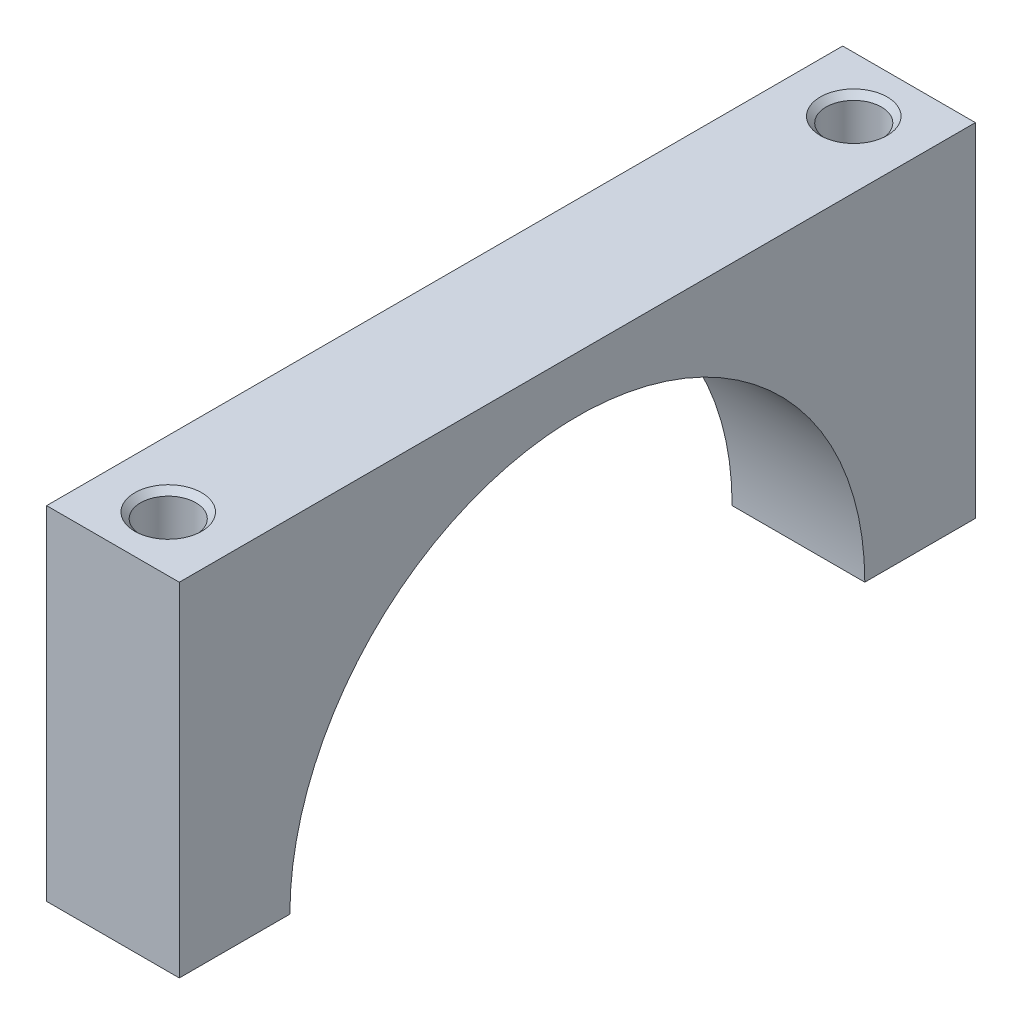
ISO-10303-21;
HEADER;
FILE_DESCRIPTION(('STEP AP214'),'2;1');
FILE_NAME('part.step','',(''),(''),'','','');
FILE_SCHEMA(('AUTOMOTIVE_DESIGN { 1 0 10303 214 1 1 1 1 }'));
ENDSEC;
DATA;
#1=APPLICATION_CONTEXT('core data for automotive mechanical design processes');
#2=APPLICATION_PROTOCOL_DEFINITION('international standard','automotive_design',2000,#1);
#3=PRODUCT_CONTEXT('',#1,'mechanical');
#4=PRODUCT('Part','Part','',(#3));
#5=PRODUCT_RELATED_PRODUCT_CATEGORY('part','',(#4));
#6=PRODUCT_DEFINITION_FORMATION('','',#4);
#7=PRODUCT_DEFINITION_CONTEXT('part definition',#1,'design');
#8=PRODUCT_DEFINITION('design','',#6,#7);
#9=PRODUCT_DEFINITION_SHAPE('','',#8);
#10=(LENGTH_UNIT() NAMED_UNIT(*) SI_UNIT(.MILLI.,.METRE.));
#11=(NAMED_UNIT(*) PLANE_ANGLE_UNIT() SI_UNIT($,.RADIAN.));
#12=(NAMED_UNIT(*) SI_UNIT($,.STERADIAN.) SOLID_ANGLE_UNIT());
#13=UNCERTAINTY_MEASURE_WITH_UNIT(LENGTH_MEASURE(1.E-05),#10,'distance_accuracy_value','');
#14=(GEOMETRIC_REPRESENTATION_CONTEXT(3) GLOBAL_UNCERTAINTY_ASSIGNED_CONTEXT((#13)) GLOBAL_UNIT_ASSIGNED_CONTEXT((#10,
#11,#12)) REPRESENTATION_CONTEXT('',''));
#15=CARTESIAN_POINT('',(0.,0.,0.));
#16=DIRECTION('',(0.,0.,1.));
#17=DIRECTION('',(1.,0.,0.));
#18=AXIS2_PLACEMENT_3D('',#15,#16,#17);
#19=CARTESIAN_POINT('',(6.,0.,36.));
#20=DIRECTION('',(0.,0.,-1.));
#21=DIRECTION('',(0.,1.,0.));
#22=AXIS2_PLACEMENT_3D('',#19,#20,#21);
#23=PLANE('',#22);
#24=DIRECTION('',(0.,-1.,0.));
#25=VECTOR('',#24,1.);
#26=CARTESIAN_POINT('',(-6.,0.,36.));
#27=LINE('',#26,#25);
#28=CARTESIAN_POINT('',(-6.,0.,36.));
#29=VERTEX_POINT('',#28);
#30=CARTESIAN_POINT('',(-6.,-31.,36.));
#31=VERTEX_POINT('',#30);
#32=EDGE_CURVE('E118',#29,#31,#27,.T.);
#33=ORIENTED_EDGE('',*,*,#32,.T.);
#34=DIRECTION('',(-1.,0.,0.));
#35=VECTOR('',#34,1.);
#36=CARTESIAN_POINT('',(6.,-31.,36.));
#37=LINE('',#36,#35);
#38=CARTESIAN_POINT('',(6.,-31.,36.));
#39=VERTEX_POINT('',#38);
#40=EDGE_CURVE('E11',#39,#31,#37,.T.);
#41=ORIENTED_EDGE('',*,*,#40,.F.);
#42=DIRECTION('',(0.,-1.,0.));
#43=VECTOR('',#42,1.);
#44=CARTESIAN_POINT('',(6.,0.,36.));
#45=LINE('',#44,#43);
#46=CARTESIAN_POINT('',(6.,0.,36.));
#47=VERTEX_POINT('',#46);
#48=EDGE_CURVE('E129',#47,#39,#45,.T.);
#49=ORIENTED_EDGE('',*,*,#48,.F.);
#50=DIRECTION('',(-1.,0.,0.));
#51=VECTOR('',#50,1.);
#52=CARTESIAN_POINT('',(6.,0.,36.));
#53=LINE('',#52,#51);
#54=EDGE_CURVE('E114',#47,#29,#53,.T.);
#55=ORIENTED_EDGE('',*,*,#54,.T.);
#56=EDGE_LOOP('',(#33,#41,#49,#55));
#57=FACE_BOUND('',#56,.T.);
#58=ADVANCED_FACE('F34',(#57),#23,.F.);
#59=CARTESIAN_POINT('',(6.,-31.,36.));
#60=DIRECTION('',(0.,1.,0.));
#61=DIRECTION('',(0.,0.,1.));
#62=AXIS2_PLACEMENT_3D('',#59,#60,#61);
#63=PLANE('',#62);
#64=CARTESIAN_POINT('',(0.,-31.,31.));
#65=DIRECTION('',(0.,1.,0.));
#66=DIRECTION('',(0.,0.,1.));
#67=AXIS2_PLACEMENT_3D('',#64,#65,#66);
#68=CIRCLE('',#67,2.49999999999999);
#69=CARTESIAN_POINT('',(0.,-31.,33.5));
#70=VERTEX_POINT('',#69);
#71=EDGE_CURVE('E184',#70,#70,#68,.T.);
#72=ORIENTED_EDGE('',*,*,#71,.T.);
#73=EDGE_LOOP('',(#72));
#74=FACE_BOUND('',#73,.T.);
#75=DIRECTION('',(0.,0.,-1.));
#76=VECTOR('',#75,1.);
#77=CARTESIAN_POINT('',(-6.,-31.,36.));
#78=LINE('',#77,#76);
#79=CARTESIAN_POINT('',(-6.,-31.,26.));
#80=VERTEX_POINT('',#79);
#81=EDGE_CURVE('E121',#31,#80,#78,.T.);
#82=ORIENTED_EDGE('',*,*,#81,.T.);
#83=DIRECTION('',(-1.,0.,0.));
#84=VECTOR('',#83,1.);
#85=CARTESIAN_POINT('',(6.,-31.,26.));
#86=LINE('',#85,#84);
#87=CARTESIAN_POINT('',(6.,-31.,26.));
#88=VERTEX_POINT('',#87);
#89=EDGE_CURVE('E42',#88,#80,#86,.T.);
#90=ORIENTED_EDGE('',*,*,#89,.F.);
#91=DIRECTION('',(0.,0.,-1.));
#92=VECTOR('',#91,1.);
#93=CARTESIAN_POINT('',(6.,-31.,36.));
#94=LINE('',#93,#92);
#95=EDGE_CURVE('E87',#39,#88,#94,.T.);
#96=ORIENTED_EDGE('',*,*,#95,.F.);
#97=ORIENTED_EDGE('',*,*,#40,.T.);
#98=EDGE_LOOP('',(#82,#90,#96,#97));
#99=FACE_BOUND('',#98,.T.);
#100=ADVANCED_FACE('F156',(#74,#99),#63,.F.);
#101=CARTESIAN_POINT('',(6.,-31.,0.));
#102=DIRECTION('',(-1.,0.,0.));
#103=DIRECTION('',(0.,0.,1.));
#104=AXIS2_PLACEMENT_3D('',#101,#102,#103);
#105=CYLINDRICAL_SURFACE('',#104,26.);
#106=CARTESIAN_POINT('',(-6.,-31.,0.));
#107=DIRECTION('',(-1.,0.,0.));
#108=DIRECTION('',(0.,0.,-1.));
#109=AXIS2_PLACEMENT_3D('',#106,#107,#108);
#110=CIRCLE('',#109,26.);
#111=CARTESIAN_POINT('',(-6.,-31.,-26.));
#112=VERTEX_POINT('',#111);
#113=EDGE_CURVE('E124',#80,#112,#110,.T.);
#114=ORIENTED_EDGE('',*,*,#113,.T.);
#115=DIRECTION('',(-1.,0.,0.));
#116=VECTOR('',#115,1.);
#117=CARTESIAN_POINT('',(6.,-31.,-26.));
#118=LINE('',#117,#116);
#119=CARTESIAN_POINT('',(6.,-31.,-26.));
#120=VERTEX_POINT('',#119);
#121=EDGE_CURVE('E109',#120,#112,#118,.T.);
#122=ORIENTED_EDGE('',*,*,#121,.F.);
#123=CARTESIAN_POINT('',(6.,-31.,0.));
#124=DIRECTION('',(-1.,0.,0.));
#125=DIRECTION('',(0.,0.,-1.));
#126=AXIS2_PLACEMENT_3D('',#123,#124,#125);
#127=CIRCLE('',#126,26.);
#128=EDGE_CURVE('E100',#88,#120,#127,.T.);
#129=ORIENTED_EDGE('',*,*,#128,.F.);
#130=ORIENTED_EDGE('',*,*,#89,.T.);
#131=EDGE_LOOP('',(#114,#122,#129,#130));
#132=FACE_BOUND('',#131,.T.);
#133=ADVANCED_FACE('F135',(#132),#105,.F.);
#134=CARTESIAN_POINT('',(6.,-31.,-36.));
#135=DIRECTION('',(0.,1.,0.));
#136=DIRECTION('',(0.,0.,1.));
#137=AXIS2_PLACEMENT_3D('',#134,#135,#136);
#138=PLANE('',#137);
#139=CARTESIAN_POINT('',(0.,-31.,-31.));
#140=DIRECTION('',(0.,1.,0.));
#141=DIRECTION('',(0.,0.,1.));
#142=AXIS2_PLACEMENT_3D('',#139,#140,#141);
#143=CIRCLE('',#142,2.49999999999999);
#144=CARTESIAN_POINT('',(0.,-31.,-28.5));
#145=VERTEX_POINT('',#144);
#146=EDGE_CURVE('E122',#145,#145,#143,.T.);
#147=ORIENTED_EDGE('',*,*,#146,.T.);
#148=EDGE_LOOP('',(#147));
#149=FACE_BOUND('',#148,.T.);
#150=DIRECTION('',(0.,0.,-1.));
#151=VECTOR('',#150,1.);
#152=CARTESIAN_POINT('',(-6.,-31.,-36.));
#153=LINE('',#152,#151);
#154=CARTESIAN_POINT('',(-6.,-31.,-36.));
#155=VERTEX_POINT('',#154);
#156=EDGE_CURVE('E108',#112,#155,#153,.T.);
#157=ORIENTED_EDGE('',*,*,#156,.T.);
#158=DIRECTION('',(-1.,0.,0.));
#159=VECTOR('',#158,1.);
#160=CARTESIAN_POINT('',(6.,-31.,-36.));
#161=LINE('',#160,#159);
#162=CARTESIAN_POINT('',(6.,-31.,-36.));
#163=VERTEX_POINT('',#162);
#164=EDGE_CURVE('E105',#163,#155,#161,.T.);
#165=ORIENTED_EDGE('',*,*,#164,.F.);
#166=DIRECTION('',(0.,0.,-1.));
#167=VECTOR('',#166,1.);
#168=CARTESIAN_POINT('',(6.,-31.,-36.));
#169=LINE('',#168,#167);
#170=EDGE_CURVE('E94',#120,#163,#169,.T.);
#171=ORIENTED_EDGE('',*,*,#170,.F.);
#172=ORIENTED_EDGE('',*,*,#121,.T.);
#173=EDGE_LOOP('',(#157,#165,#171,#172));
#174=FACE_BOUND('',#173,.T.);
#175=ADVANCED_FACE('F106',(#149,#174),#138,.F.);
#176=CARTESIAN_POINT('',(6.,0.,-36.));
#177=DIRECTION('',(0.,0.,1.));
#178=DIRECTION('',(0.,-1.,0.));
#179=AXIS2_PLACEMENT_3D('',#176,#177,#178);
#180=PLANE('',#179);
#181=DIRECTION('',(0.,1.,0.));
#182=VECTOR('',#181,1.);
#183=CARTESIAN_POINT('',(-6.,0.,-36.));
#184=LINE('',#183,#182);
#185=CARTESIAN_POINT('',(-6.,0.,-36.));
#186=VERTEX_POINT('',#185);
#187=EDGE_CURVE('E73',#155,#186,#184,.T.);
#188=ORIENTED_EDGE('',*,*,#187,.T.);
#189=DIRECTION('',(-1.,0.,0.));
#190=VECTOR('',#189,1.);
#191=CARTESIAN_POINT('',(6.,0.,-36.));
#192=LINE('',#191,#190);
#193=CARTESIAN_POINT('',(6.,0.,-36.));
#194=VERTEX_POINT('',#193);
#195=EDGE_CURVE('E110',#194,#186,#192,.T.);
#196=ORIENTED_EDGE('',*,*,#195,.F.);
#197=DIRECTION('',(0.,1.,0.));
#198=VECTOR('',#197,1.);
#199=CARTESIAN_POINT('',(6.,0.,-36.));
#200=LINE('',#199,#198);
#201=EDGE_CURVE('E98',#163,#194,#200,.T.);
#202=ORIENTED_EDGE('',*,*,#201,.F.);
#203=ORIENTED_EDGE('',*,*,#164,.T.);
#204=EDGE_LOOP('',(#188,#196,#202,#203));
#205=FACE_BOUND('',#204,.T.);
#206=ADVANCED_FACE('F112',(#205),#180,.F.);
#207=CARTESIAN_POINT('',(6.,0.,36.));
#208=DIRECTION('',(0.,-1.,0.));
#209=DIRECTION('',(0.,0.,-1.));
#210=AXIS2_PLACEMENT_3D('',#207,#208,#209);
#211=PLANE('',#210);
#212=CARTESIAN_POINT('',(0.,0.,31.));
#213=DIRECTION('',(0.,1.,0.));
#214=DIRECTION('',(0.,0.,1.));
#215=AXIS2_PLACEMENT_3D('',#212,#213,#214);
#216=CIRCLE('',#215,3.025);
#217=CARTESIAN_POINT('',(0.,0.,34.025));
#218=VERTEX_POINT('',#217);
#219=EDGE_CURVE('E189',#218,#218,#216,.T.);
#220=ORIENTED_EDGE('',*,*,#219,.F.);
#221=EDGE_LOOP('',(#220));
#222=FACE_BOUND('',#221,.T.);
#223=CARTESIAN_POINT('',(0.,0.,-31.));
#224=DIRECTION('',(0.,1.,0.));
#225=DIRECTION('',(0.,0.,1.));
#226=AXIS2_PLACEMENT_3D('',#223,#224,#225);
#227=CIRCLE('',#226,3.025);
#228=CARTESIAN_POINT('',(0.,0.,-27.975));
#229=VERTEX_POINT('',#228);
#230=EDGE_CURVE('E177',#229,#229,#227,.T.);
#231=ORIENTED_EDGE('',*,*,#230,.F.);
#232=EDGE_LOOP('',(#231));
#233=FACE_BOUND('',#232,.T.);
#234=DIRECTION('',(0.,0.,1.));
#235=VECTOR('',#234,1.);
#236=CARTESIAN_POINT('',(-6.,0.,36.));
#237=LINE('',#236,#235);
#238=EDGE_CURVE('E79',#186,#29,#237,.T.);
#239=ORIENTED_EDGE('',*,*,#238,.T.);
#240=ORIENTED_EDGE('',*,*,#54,.F.);
#241=DIRECTION('',(0.,0.,1.));
#242=VECTOR('',#241,1.);
#243=CARTESIAN_POINT('',(6.,0.,36.));
#244=LINE('',#243,#242);
#245=EDGE_CURVE('E50',#194,#47,#244,.T.);
#246=ORIENTED_EDGE('',*,*,#245,.F.);
#247=ORIENTED_EDGE('',*,*,#195,.T.);
#248=EDGE_LOOP('',(#239,#240,#246,#247));
#249=FACE_BOUND('',#248,.T.);
#250=ADVANCED_FACE('F142',(#222,#233,#249),#211,.F.);
#251=CARTESIAN_POINT('',(6.,-31.,0.));
#252=DIRECTION('',(1.,0.,0.));
#253=DIRECTION('',(0.,0.,-1.));
#254=AXIS2_PLACEMENT_3D('',#251,#252,#253);
#255=PLANE('',#254);
#256=ORIENTED_EDGE('',*,*,#48,.T.);
#257=ORIENTED_EDGE('',*,*,#95,.T.);
#258=ORIENTED_EDGE('',*,*,#128,.T.);
#259=ORIENTED_EDGE('',*,*,#170,.T.);
#260=ORIENTED_EDGE('',*,*,#201,.T.);
#261=ORIENTED_EDGE('',*,*,#245,.T.);
#262=EDGE_LOOP('',(#256,#257,#258,#259,#260,#261));
#263=FACE_BOUND('',#262,.T.);
#264=ADVANCED_FACE('F96',(#263),#255,.T.);
#265=CARTESIAN_POINT('',(-6.,-31.,0.));
#266=DIRECTION('',(1.,0.,0.));
#267=DIRECTION('',(0.,0.,-1.));
#268=AXIS2_PLACEMENT_3D('',#265,#266,#267);
#269=PLANE('',#268);
#270=ORIENTED_EDGE('',*,*,#32,.F.);
#271=ORIENTED_EDGE('',*,*,#238,.F.);
#272=ORIENTED_EDGE('',*,*,#187,.F.);
#273=ORIENTED_EDGE('',*,*,#156,.F.);
#274=ORIENTED_EDGE('',*,*,#113,.F.);
#275=ORIENTED_EDGE('',*,*,#81,.F.);
#276=EDGE_LOOP('',(#270,#271,#272,#273,#274,#275));
#277=FACE_BOUND('',#276,.T.);
#278=ADVANCED_FACE('F138',(#277),#269,.F.);
#279=CARTESIAN_POINT('',(0.,0.,-31.));
#280=DIRECTION('',(0.,1.,0.));
#281=DIRECTION('',(0.,0.,1.));
#282=AXIS2_PLACEMENT_3D('',#279,#280,#281);
#283=CYLINDRICAL_SURFACE('',#282,2.5);
#284=ORIENTED_EDGE('',*,*,#146,.F.);
#285=EDGE_LOOP('',(#284));
#286=FACE_BOUND('',#285,.T.);
#287=CARTESIAN_POINT('',(0.,-0.524999999999997,-31.));
#288=DIRECTION('',(0.,1.,0.));
#289=DIRECTION('',(0.,0.,1.));
#290=AXIS2_PLACEMENT_3D('',#287,#288,#289);
#291=CIRCLE('',#290,2.5);
#292=CARTESIAN_POINT('',(0.,-0.524999999999998,-28.5));
#293=VERTEX_POINT('',#292);
#294=EDGE_CURVE('E174',#293,#293,#291,.T.);
#295=ORIENTED_EDGE('',*,*,#294,.T.);
#296=EDGE_LOOP('',(#295));
#297=FACE_BOUND('',#296,.T.);
#298=ADVANCED_FACE('F207',(#286,#297),#283,.F.);
#299=CARTESIAN_POINT('',(0.,0.,-31.));
#300=DIRECTION('',(0.,1.,0.));
#301=DIRECTION('',(0.,0.,1.));
#302=AXIS2_PLACEMENT_3D('',#299,#300,#301);
#303=CONICAL_SURFACE('',#302,3.025,0.785398163397448);
#304=ORIENTED_EDGE('',*,*,#294,.F.);
#305=EDGE_LOOP('',(#304));
#306=FACE_BOUND('',#305,.T.);
#307=ORIENTED_EDGE('',*,*,#230,.T.);
#308=EDGE_LOOP('',(#307));
#309=FACE_BOUND('',#308,.T.);
#310=ADVANCED_FACE('F200',(#306,#309),#303,.F.);
#311=CARTESIAN_POINT('',(0.,0.,31.));
#312=DIRECTION('',(0.,1.,0.));
#313=DIRECTION('',(0.,0.,1.));
#314=AXIS2_PLACEMENT_3D('',#311,#312,#313);
#315=CYLINDRICAL_SURFACE('',#314,2.5);
#316=ORIENTED_EDGE('',*,*,#71,.F.);
#317=EDGE_LOOP('',(#316));
#318=FACE_BOUND('',#317,.T.);
#319=CARTESIAN_POINT('',(0.,-0.525000000000005,31.));
#320=DIRECTION('',(0.,1.,0.));
#321=DIRECTION('',(0.,0.,1.));
#322=AXIS2_PLACEMENT_3D('',#319,#320,#321);
#323=CIRCLE('',#322,2.5);
#324=CARTESIAN_POINT('',(0.,-0.525000000000005,33.5));
#325=VERTEX_POINT('',#324);
#326=EDGE_CURVE('E186',#325,#325,#323,.T.);
#327=ORIENTED_EDGE('',*,*,#326,.T.);
#328=EDGE_LOOP('',(#327));
#329=FACE_BOUND('',#328,.T.);
#330=ADVANCED_FACE('F194',(#318,#329),#315,.F.);
#331=CARTESIAN_POINT('',(0.,0.,31.));
#332=DIRECTION('',(0.,1.,0.));
#333=DIRECTION('',(0.,0.,1.));
#334=AXIS2_PLACEMENT_3D('',#331,#332,#333);
#335=CONICAL_SURFACE('',#334,3.025,0.785398163397448);
#336=ORIENTED_EDGE('',*,*,#326,.F.);
#337=EDGE_LOOP('',(#336));
#338=FACE_BOUND('',#337,.T.);
#339=ORIENTED_EDGE('',*,*,#219,.T.);
#340=EDGE_LOOP('',(#339));
#341=FACE_BOUND('',#340,.T.);
#342=ADVANCED_FACE('F192',(#338,#341),#335,.F.);
#343=CLOSED_SHELL('',(#58,#100,#133,#175,#206,#250,#264,#278,#298,#310,#330,#342));
#344=MANIFOLD_SOLID_BREP('B2',#343);
#345=ADVANCED_BREP_SHAPE_REPRESENTATION('',(#18,#344),#14);
#346=SHAPE_DEFINITION_REPRESENTATION(#9,#345);
ENDSEC;
END-ISO-10303-21;
